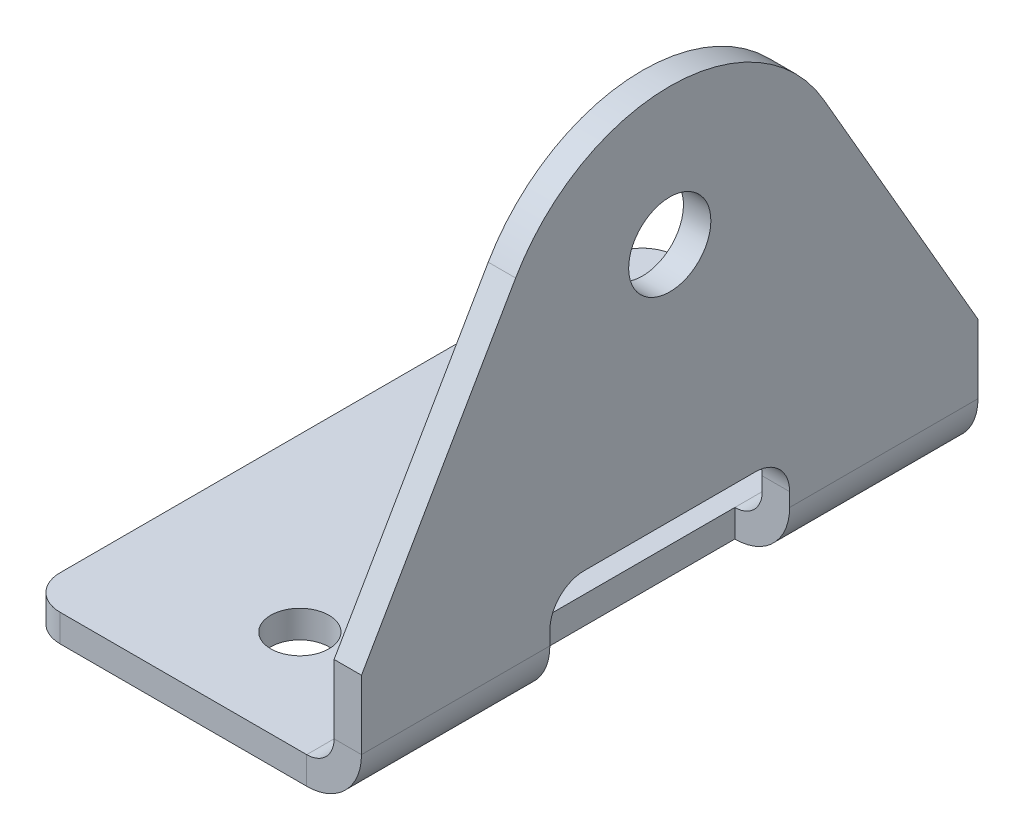
ISO-10303-21;
HEADER;
FILE_DESCRIPTION(('STEP AP214'),'2;1');
FILE_NAME('part.step','',(''),(''),'','','');
FILE_SCHEMA(('AUTOMOTIVE_DESIGN { 1 0 10303 214 1 1 1 1 }'));
ENDSEC;
DATA;
#1=APPLICATION_CONTEXT('core data for automotive mechanical design processes');
#2=APPLICATION_PROTOCOL_DEFINITION('international standard','automotive_design',2000,#1);
#3=PRODUCT_CONTEXT('',#1,'mechanical');
#4=PRODUCT('Part','Part','',(#3));
#5=PRODUCT_RELATED_PRODUCT_CATEGORY('part','',(#4));
#6=PRODUCT_DEFINITION_FORMATION('','',#4);
#7=PRODUCT_DEFINITION_CONTEXT('part definition',#1,'design');
#8=PRODUCT_DEFINITION('design','',#6,#7);
#9=PRODUCT_DEFINITION_SHAPE('','',#8);
#10=(LENGTH_UNIT() NAMED_UNIT(*) SI_UNIT(.MILLI.,.METRE.));
#11=(NAMED_UNIT(*) PLANE_ANGLE_UNIT() SI_UNIT($,.RADIAN.));
#12=(NAMED_UNIT(*) SI_UNIT($,.STERADIAN.) SOLID_ANGLE_UNIT());
#13=UNCERTAINTY_MEASURE_WITH_UNIT(LENGTH_MEASURE(1.E-05),#10,'distance_accuracy_value','');
#14=(GEOMETRIC_REPRESENTATION_CONTEXT(3) GLOBAL_UNCERTAINTY_ASSIGNED_CONTEXT((#13)) GLOBAL_UNIT_ASSIGNED_CONTEXT((#10,
#11,#12)) REPRESENTATION_CONTEXT('',''));
#15=CARTESIAN_POINT('',(0.,0.,0.));
#16=DIRECTION('',(0.,0.,1.));
#17=DIRECTION('',(1.,0.,0.));
#18=AXIS2_PLACEMENT_3D('',#15,#16,#17);
#19=CARTESIAN_POINT('',(28.5000000000002,44.0192378864669,0.));
#20=DIRECTION('',(1.,0.,0.));
#21=DIRECTION('',(0.,1.,0.));
#22=AXIS2_PLACEMENT_3D('',#19,#20,#21);
#23=CYLINDRICAL_SURFACE('',#22,25.9807621135331);
#24=DIRECTION('',(-1.,0.,0.));
#25=VECTOR('',#24,1.);
#26=CARTESIAN_POINT('',(28.5000000000002,57.0096189432335,22.4999999999999));
#27=LINE('',#26,#25);
#28=CARTESIAN_POINT('',(28.5000000000002,57.0096189432335,22.4999999999999));
#29=VERTEX_POINT('',#28);
#30=CARTESIAN_POINT('',(24.5000000000002,57.0096189432335,22.4999999999999));
#31=VERTEX_POINT('',#30);
#32=EDGE_CURVE('E292',#29,#31,#27,.T.);
#33=ORIENTED_EDGE('',*,*,#32,.F.);
#34=CARTESIAN_POINT('',(28.5000000000001,44.0192378864669,0.));
#35=DIRECTION('',(1.,0.,0.));
#36=DIRECTION('',(0.,1.,0.));
#37=AXIS2_PLACEMENT_3D('',#34,#35,#36);
#38=CIRCLE('',#37,25.9807621135331);
#39=CARTESIAN_POINT('',(28.5000000000002,57.0096189432335,-22.4999999999999));
#40=VERTEX_POINT('',#39);
#41=EDGE_CURVE('E298',#40,#29,#38,.T.);
#42=ORIENTED_EDGE('',*,*,#41,.F.);
#43=DIRECTION('',(-1.,0.,0.));
#44=VECTOR('',#43,1.);
#45=CARTESIAN_POINT('',(28.5000000000002,57.0096189432335,-22.4999999999999));
#46=LINE('',#45,#44);
#47=CARTESIAN_POINT('',(24.5000000000002,57.0096189432335,-22.4999999999999));
#48=VERTEX_POINT('',#47);
#49=EDGE_CURVE('E295',#48,#40,#46,.F.);
#50=ORIENTED_EDGE('',*,*,#49,.F.);
#51=CARTESIAN_POINT('',(24.5000000000001,44.019237886467,0.));
#52=DIRECTION('',(1.,0.,0.));
#53=DIRECTION('',(0.,1.,0.));
#54=AXIS2_PLACEMENT_3D('',#51,#52,#53);
#55=CIRCLE('',#54,25.9807621135331);
#56=EDGE_CURVE('E300',#31,#48,#55,.F.);
#57=ORIENTED_EDGE('',*,*,#56,.F.);
#58=EDGE_LOOP('',(#33,#42,#50,#57));
#59=FACE_BOUND('',#58,.T.);
#60=ADVANCED_FACE('F72',(#59),#23,.T.);
#61=CARTESIAN_POINT('',(20.5,14.9999999999999,17.5));
#62=DIRECTION('',(0.,0.,1.));
#63=DIRECTION('',(0.,-1.,0.));
#64=AXIS2_PLACEMENT_3D('',#61,#62,#63);
#65=PLANE('',#64);
#66=DIRECTION('',(0.,-1.,0.));
#67=VECTOR('',#66,1.);
#68=CARTESIAN_POINT('',(24.5,0.,17.5));
#69=LINE('',#68,#67);
#70=CARTESIAN_POINT('',(24.5,9.99999999999993,17.5));
#71=VERTEX_POINT('',#70);
#72=CARTESIAN_POINT('',(24.5,7.99999999999998,17.5));
#73=VERTEX_POINT('',#72);
#74=EDGE_CURVE('E274',#71,#73,#69,.T.);
#75=ORIENTED_EDGE('',*,*,#74,.F.);
#76=DIRECTION('',(1.,0.,0.));
#77=VECTOR('',#76,1.);
#78=CARTESIAN_POINT('',(28.5,9.99999999999991,17.5));
#79=LINE('',#78,#77);
#80=CARTESIAN_POINT('',(28.5,9.99999999999991,17.5));
#81=VERTEX_POINT('',#80);
#82=EDGE_CURVE('E327',#71,#81,#79,.T.);
#83=ORIENTED_EDGE('',*,*,#82,.T.);
#84=DIRECTION('',(0.,-1.,0.));
#85=VECTOR('',#84,1.);
#86=CARTESIAN_POINT('',(28.5,14.9999999999999,17.5));
#87=LINE('',#86,#85);
#88=CARTESIAN_POINT('',(28.5,7.99999999999997,17.5));
#89=VERTEX_POINT('',#88);
#90=EDGE_CURVE('E338',#81,#89,#87,.T.);
#91=ORIENTED_EDGE('',*,*,#90,.T.);
#92=DIRECTION('',(-1.,0.,0.));
#93=VECTOR('',#92,1.);
#94=CARTESIAN_POINT('',(28.5,7.99999999999997,17.5));
#95=LINE('',#94,#93);
#96=EDGE_CURVE('E216',#89,#73,#95,.T.);
#97=ORIENTED_EDGE('',*,*,#96,.T.);
#98=EDGE_LOOP('',(#75,#83,#91,#97));
#99=FACE_BOUND('',#98,.T.);
#100=ADVANCED_FACE('F346',(#99),#65,.F.);
#101=CARTESIAN_POINT('',(20.5,8.,-45.));
#102=DIRECTION('',(0.,0.,-1.));
#103=DIRECTION('',(1.,0.,0.));
#104=AXIS2_PLACEMENT_3D('',#101,#102,#103);
#105=CYLINDRICAL_SURFACE('',#104,8.);
#106=CARTESIAN_POINT('',(20.5,8.,17.5));
#107=DIRECTION('',(0.,0.,1.));
#108=DIRECTION('',(0.,-1.,0.));
#109=AXIS2_PLACEMENT_3D('',#106,#107,#108);
#110=CIRCLE('',#109,8.);
#111=CARTESIAN_POINT('',(20.5,0.,17.5));
#112=VERTEX_POINT('',#111);
#113=EDGE_CURVE('E209',#89,#112,#110,.F.);
#114=ORIENTED_EDGE('',*,*,#113,.F.);
#115=DIRECTION('',(0.,0.,-1.));
#116=VECTOR('',#115,1.);
#117=CARTESIAN_POINT('',(28.5,7.99999999999997,0.));
#118=LINE('',#117,#116);
#119=CARTESIAN_POINT('',(28.5,7.99999999999997,45.));
#120=VERTEX_POINT('',#119);
#121=EDGE_CURVE('E367',#120,#89,#118,.T.);
#122=ORIENTED_EDGE('',*,*,#121,.F.);
#123=CARTESIAN_POINT('',(20.5,8.,45.));
#124=DIRECTION('',(0.,0.,-1.));
#125=DIRECTION('',(-1.,0.,0.));
#126=AXIS2_PLACEMENT_3D('',#123,#124,#125);
#127=CIRCLE('',#126,8.);
#128=CARTESIAN_POINT('',(20.5,0.,45.));
#129=VERTEX_POINT('',#128);
#130=EDGE_CURVE('E249',#129,#120,#127,.F.);
#131=ORIENTED_EDGE('',*,*,#130,.F.);
#132=DIRECTION('',(0.,0.,-1.));
#133=VECTOR('',#132,1.);
#134=CARTESIAN_POINT('',(20.5,0.,45.));
#135=LINE('',#134,#133);
#136=EDGE_CURVE('E240',#129,#112,#135,.T.);
#137=ORIENTED_EDGE('',*,*,#136,.T.);
#138=EDGE_LOOP('',(#114,#122,#131,#137));
#139=FACE_BOUND('',#138,.T.);
#140=ADVANCED_FACE('F247',(#139),#105,.T.);
#141=CARTESIAN_POINT('',(20.5,8.,-45.));
#142=DIRECTION('',(0.,0.,-1.));
#143=DIRECTION('',(1.,0.,0.));
#144=AXIS2_PLACEMENT_3D('',#141,#142,#143);
#145=CYLINDRICAL_SURFACE('',#144,4.);
#146=DIRECTION('',(0.,0.,1.));
#147=VECTOR('',#146,1.);
#148=CARTESIAN_POINT('',(24.5,7.99999999999999,45.));
#149=LINE('',#148,#147);
#150=CARTESIAN_POINT('',(24.5,7.99999999999998,45.));
#151=VERTEX_POINT('',#150);
#152=EDGE_CURVE('E351',#151,#73,#149,.F.);
#153=ORIENTED_EDGE('',*,*,#152,.T.);
#154=CARTESIAN_POINT('',(20.5,8.,17.5));
#155=DIRECTION('',(0.,0.,1.));
#156=DIRECTION('',(0.,-1.,0.));
#157=AXIS2_PLACEMENT_3D('',#154,#155,#156);
#158=CIRCLE('',#157,4.);
#159=CARTESIAN_POINT('',(20.5,4.,17.5));
#160=VERTEX_POINT('',#159);
#161=EDGE_CURVE('E221',#73,#160,#158,.F.);
#162=ORIENTED_EDGE('',*,*,#161,.T.);
#163=DIRECTION('',(0.,0.,-1.));
#164=VECTOR('',#163,1.);
#165=CARTESIAN_POINT('',(20.5,4.,45.));
#166=LINE('',#165,#164);
#167=CARTESIAN_POINT('',(20.5,4.,45.));
#168=VERTEX_POINT('',#167);
#169=EDGE_CURVE('E395',#168,#160,#166,.T.);
#170=ORIENTED_EDGE('',*,*,#169,.F.);
#171=CARTESIAN_POINT('',(20.5,8.,45.));
#172=DIRECTION('',(0.,0.,-1.));
#173=DIRECTION('',(-1.,0.,0.));
#174=AXIS2_PLACEMENT_3D('',#171,#172,#173);
#175=CIRCLE('',#174,4.);
#176=EDGE_CURVE('E384',#168,#151,#175,.F.);
#177=ORIENTED_EDGE('',*,*,#176,.T.);
#178=EDGE_LOOP('',(#153,#162,#170,#177));
#179=FACE_BOUND('',#178,.T.);
#180=ADVANCED_FACE('F480',(#179),#145,.F.);
#181=CARTESIAN_POINT('',(-20.5,4.,45.));
#182=DIRECTION('',(1.,0.,0.));
#183=DIRECTION('',(0.,0.,-1.));
#184=AXIS2_PLACEMENT_3D('',#181,#182,#183);
#185=PLANE('',#184);
#186=DIRECTION('',(0.,0.,1.));
#187=VECTOR('',#186,1.);
#188=CARTESIAN_POINT('',(-20.5,4.,45.));
#189=LINE('',#188,#187);
#190=CARTESIAN_POINT('',(-20.5,4.,-40.));
#191=VERTEX_POINT('',#190);
#192=CARTESIAN_POINT('',(-20.5,4.,40.));
#193=VERTEX_POINT('',#192);
#194=EDGE_CURVE('E253',#191,#193,#189,.T.);
#195=ORIENTED_EDGE('',*,*,#194,.F.);
#196=DIRECTION('',(0.,-1.,0.));
#197=VECTOR('',#196,1.);
#198=CARTESIAN_POINT('',(-20.5,4.,-40.));
#199=LINE('',#198,#197);
#200=CARTESIAN_POINT('',(-20.5,0.,-40.));
#201=VERTEX_POINT('',#200);
#202=EDGE_CURVE('E304',#191,#201,#199,.T.);
#203=ORIENTED_EDGE('',*,*,#202,.T.);
#204=DIRECTION('',(0.,0.,1.));
#205=VECTOR('',#204,1.);
#206=CARTESIAN_POINT('',(-20.5,0.,45.));
#207=LINE('',#206,#205);
#208=CARTESIAN_POINT('',(-20.5,0.,40.));
#209=VERTEX_POINT('',#208);
#210=EDGE_CURVE('E380',#201,#209,#207,.T.);
#211=ORIENTED_EDGE('',*,*,#210,.T.);
#212=DIRECTION('',(0.,-1.,0.));
#213=VECTOR('',#212,1.);
#214=CARTESIAN_POINT('',(-20.5,4.,40.));
#215=LINE('',#214,#213);
#216=EDGE_CURVE('E302',#209,#193,#215,.F.);
#217=ORIENTED_EDGE('',*,*,#216,.T.);
#218=EDGE_LOOP('',(#195,#203,#211,#217));
#219=FACE_BOUND('',#218,.T.);
#220=ADVANCED_FACE('F412',(#219),#185,.F.);
#221=CARTESIAN_POINT('',(20.5,4.,45.));
#222=DIRECTION('',(0.,0.,-1.));
#223=DIRECTION('',(-1.,0.,0.));
#224=AXIS2_PLACEMENT_3D('',#221,#222,#223);
#225=PLANE('',#224);
#226=DIRECTION('',(1.,0.,0.));
#227=VECTOR('',#226,1.);
#228=CARTESIAN_POINT('',(20.5,4.,45.));
#229=LINE('',#228,#227);
#230=CARTESIAN_POINT('',(-15.5,4.,45.));
#231=VERTEX_POINT('',#230);
#232=EDGE_CURVE('E392',#231,#168,#229,.T.);
#233=ORIENTED_EDGE('',*,*,#232,.F.);
#234=DIRECTION('',(0.,-1.,0.));
#235=VECTOR('',#234,1.);
#236=CARTESIAN_POINT('',(-15.5,4.,45.));
#237=LINE('',#236,#235);
#238=CARTESIAN_POINT('',(-15.5,0.,45.));
#239=VERTEX_POINT('',#238);
#240=EDGE_CURVE('E317',#231,#239,#237,.T.);
#241=ORIENTED_EDGE('',*,*,#240,.T.);
#242=DIRECTION('',(1.,0.,0.));
#243=VECTOR('',#242,1.);
#244=CARTESIAN_POINT('',(20.5,0.,45.));
#245=LINE('',#244,#243);
#246=EDGE_CURVE('E255',#239,#129,#245,.T.);
#247=ORIENTED_EDGE('',*,*,#246,.T.);
#248=DIRECTION('',(0.,-1.,0.));
#249=VECTOR('',#248,1.);
#250=CARTESIAN_POINT('',(20.5,4.,45.));
#251=LINE('',#250,#249);
#252=EDGE_CURVE('E262',#168,#129,#251,.T.);
#253=ORIENTED_EDGE('',*,*,#252,.F.);
#254=EDGE_LOOP('',(#233,#241,#247,#253));
#255=FACE_BOUND('',#254,.T.);
#256=ADVANCED_FACE('F405',(#255),#225,.F.);
#257=CARTESIAN_POINT('',(20.5,4.,-45.));
#258=DIRECTION('',(0.,0.,1.));
#259=DIRECTION('',(1.,0.,0.));
#260=AXIS2_PLACEMENT_3D('',#257,#258,#259);
#261=PLANE('',#260);
#262=DIRECTION('',(-1.,0.,0.));
#263=VECTOR('',#262,1.);
#264=CARTESIAN_POINT('',(20.5,0.,-45.));
#265=LINE('',#264,#263);
#266=CARTESIAN_POINT('',(20.5,0.,-45.));
#267=VERTEX_POINT('',#266);
#268=CARTESIAN_POINT('',(-15.5,0.,-45.));
#269=VERTEX_POINT('',#268);
#270=EDGE_CURVE('E250',#267,#269,#265,.T.);
#271=ORIENTED_EDGE('',*,*,#270,.T.);
#272=DIRECTION('',(0.,-1.,0.));
#273=VECTOR('',#272,1.);
#274=CARTESIAN_POINT('',(-15.5,4.,-45.));
#275=LINE('',#274,#273);
#276=CARTESIAN_POINT('',(-15.5,4.,-45.));
#277=VERTEX_POINT('',#276);
#278=EDGE_CURVE('E311',#269,#277,#275,.F.);
#279=ORIENTED_EDGE('',*,*,#278,.T.);
#280=DIRECTION('',(-1.,0.,0.));
#281=VECTOR('',#280,1.);
#282=CARTESIAN_POINT('',(20.5,4.,-45.));
#283=LINE('',#282,#281);
#284=CARTESIAN_POINT('',(20.5,4.,-45.));
#285=VERTEX_POINT('',#284);
#286=EDGE_CURVE('E263',#285,#277,#283,.T.);
#287=ORIENTED_EDGE('',*,*,#286,.F.);
#288=DIRECTION('',(0.,-1.,0.));
#289=VECTOR('',#288,1.);
#290=CARTESIAN_POINT('',(20.5,4.,-45.));
#291=LINE('',#290,#289);
#292=EDGE_CURVE('E259',#285,#267,#291,.T.);
#293=ORIENTED_EDGE('',*,*,#292,.T.);
#294=EDGE_LOOP('',(#271,#279,#287,#293));
#295=FACE_BOUND('',#294,.T.);
#296=ADVANCED_FACE('F422',(#295),#261,.F.);
#297=CARTESIAN_POINT('',(0.,4.,0.));
#298=DIRECTION('',(0.,1.,0.));
#299=DIRECTION('',(0.,0.,1.));
#300=AXIS2_PLACEMENT_3D('',#297,#298,#299);
#301=PLANE('',#300);
#302=CARTESIAN_POINT('',(4.5,4.,30.));
#303=DIRECTION('',(0.,1.,0.));
#304=DIRECTION('',(0.,0.,1.));
#305=AXIS2_PLACEMENT_3D('',#302,#303,#304);
#306=CIRCLE('',#305,4.25);
#307=CARTESIAN_POINT('',(4.5,4.,34.25));
#308=VERTEX_POINT('',#307);
#309=EDGE_CURVE('E378',#308,#308,#306,.T.);
#310=ORIENTED_EDGE('',*,*,#309,.F.);
#311=EDGE_LOOP('',(#310));
#312=FACE_BOUND('',#311,.T.);
#313=CARTESIAN_POINT('',(4.5,4.,-30.));
#314=DIRECTION('',(0.,1.,0.));
#315=DIRECTION('',(0.,0.,1.));
#316=AXIS2_PLACEMENT_3D('',#313,#314,#315);
#317=CIRCLE('',#316,4.25);
#318=CARTESIAN_POINT('',(4.5,4.,-25.75));
#319=VERTEX_POINT('',#318);
#320=EDGE_CURVE('E448',#319,#319,#317,.T.);
#321=ORIENTED_EDGE('',*,*,#320,.F.);
#322=EDGE_LOOP('',(#321));
#323=FACE_BOUND('',#322,.T.);
#324=ORIENTED_EDGE('',*,*,#286,.T.);
#325=CARTESIAN_POINT('',(-15.5,4.,-40.));
#326=DIRECTION('',(0.,1.,0.));
#327=DIRECTION('',(0.,0.,1.));
#328=AXIS2_PLACEMENT_3D('',#325,#326,#327);
#329=CIRCLE('',#328,5.);
#330=EDGE_CURVE('E315',#277,#191,#329,.T.);
#331=ORIENTED_EDGE('',*,*,#330,.T.);
#332=ORIENTED_EDGE('',*,*,#194,.T.);
#333=CARTESIAN_POINT('',(-15.5,4.,40.));
#334=DIRECTION('',(0.,1.,0.));
#335=DIRECTION('',(0.,0.,1.));
#336=AXIS2_PLACEMENT_3D('',#333,#334,#335);
#337=CIRCLE('',#336,5.);
#338=EDGE_CURVE('E313',#193,#231,#337,.T.);
#339=ORIENTED_EDGE('',*,*,#338,.T.);
#340=ORIENTED_EDGE('',*,*,#232,.T.);
#341=ORIENTED_EDGE('',*,*,#169,.T.);
#342=CARTESIAN_POINT('',(20.5,4.,-17.5));
#343=VERTEX_POINT('',#342);
#344=EDGE_CURVE('E231',#160,#343,#166,.T.);
#345=ORIENTED_EDGE('',*,*,#344,.T.);
#346=EDGE_CURVE('E394',#343,#285,#166,.T.);
#347=ORIENTED_EDGE('',*,*,#346,.T.);
#348=EDGE_LOOP('',(#324,#331,#332,#339,#340,#341,#345,#347));
#349=FACE_BOUND('',#348,.T.);
#350=ADVANCED_FACE('F415',(#312,#323,#349),#301,.T.);
#351=CARTESIAN_POINT('',(0.,0.,0.));
#352=DIRECTION('',(0.,1.,0.));
#353=DIRECTION('',(0.,0.,1.));
#354=AXIS2_PLACEMENT_3D('',#351,#352,#353);
#355=PLANE('',#354);
#356=CARTESIAN_POINT('',(4.5,0.,30.));
#357=DIRECTION('',(0.,-1.,0.));
#358=DIRECTION('',(0.,0.,-1.));
#359=AXIS2_PLACEMENT_3D('',#356,#357,#358);
#360=CIRCLE('',#359,4.25);
#361=CARTESIAN_POINT('',(4.5,0.,25.75));
#362=VERTEX_POINT('',#361);
#363=EDGE_CURVE('E445',#362,#362,#360,.T.);
#364=ORIENTED_EDGE('',*,*,#363,.F.);
#365=EDGE_LOOP('',(#364));
#366=FACE_BOUND('',#365,.T.);
#367=CARTESIAN_POINT('',(4.5,0.,-30.));
#368=DIRECTION('',(0.,-1.,0.));
#369=DIRECTION('',(0.,0.,-1.));
#370=AXIS2_PLACEMENT_3D('',#367,#368,#369);
#371=CIRCLE('',#370,4.25);
#372=CARTESIAN_POINT('',(4.5,0.,-34.25));
#373=VERTEX_POINT('',#372);
#374=EDGE_CURVE('E269',#373,#373,#371,.T.);
#375=ORIENTED_EDGE('',*,*,#374,.F.);
#376=EDGE_LOOP('',(#375));
#377=FACE_BOUND('',#376,.T.);
#378=ORIENTED_EDGE('',*,*,#210,.F.);
#379=CARTESIAN_POINT('',(-15.5,0.,-40.));
#380=DIRECTION('',(0.,1.,0.));
#381=DIRECTION('',(0.,0.,1.));
#382=AXIS2_PLACEMENT_3D('',#379,#380,#381);
#383=CIRCLE('',#382,5.);
#384=EDGE_CURVE('E309',#201,#269,#383,.F.);
#385=ORIENTED_EDGE('',*,*,#384,.T.);
#386=ORIENTED_EDGE('',*,*,#270,.F.);
#387=CARTESIAN_POINT('',(20.5,0.,-17.5));
#388=VERTEX_POINT('',#387);
#389=EDGE_CURVE('E243',#388,#267,#135,.T.);
#390=ORIENTED_EDGE('',*,*,#389,.F.);
#391=DIRECTION('',(0.,0.,-1.));
#392=VECTOR('',#391,1.);
#393=CARTESIAN_POINT('',(20.5,0.,17.5));
#394=LINE('',#393,#392);
#395=EDGE_CURVE('E228',#112,#388,#394,.T.);
#396=ORIENTED_EDGE('',*,*,#395,.F.);
#397=ORIENTED_EDGE('',*,*,#136,.F.);
#398=ORIENTED_EDGE('',*,*,#246,.F.);
#399=CARTESIAN_POINT('',(-15.5,0.,40.));
#400=DIRECTION('',(0.,1.,0.));
#401=DIRECTION('',(0.,0.,1.));
#402=AXIS2_PLACEMENT_3D('',#399,#400,#401);
#403=CIRCLE('',#402,5.);
#404=EDGE_CURVE('E307',#239,#209,#403,.F.);
#405=ORIENTED_EDGE('',*,*,#404,.T.);
#406=EDGE_LOOP('',(#378,#385,#386,#390,#396,#397,#398,#405));
#407=FACE_BOUND('',#406,.T.);
#408=ADVANCED_FACE('F238',(#366,#377,#407),#355,.F.);
#409=CARTESIAN_POINT('',(20.5,8.,45.));
#410=DIRECTION('',(0.,0.,1.));
#411=DIRECTION('',(1.,0.,0.));
#412=AXIS2_PLACEMENT_3D('',#409,#410,#411);
#413=PLANE('',#412);
#414=DIRECTION('',(1.,0.,0.));
#415=VECTOR('',#414,1.);
#416=CARTESIAN_POINT('',(28.5,7.99999999999997,45.));
#417=LINE('',#416,#415);
#418=EDGE_CURVE('E363',#151,#120,#417,.T.);
#419=ORIENTED_EDGE('',*,*,#418,.F.);
#420=ORIENTED_EDGE('',*,*,#176,.F.);
#421=ORIENTED_EDGE('',*,*,#252,.T.);
#422=ORIENTED_EDGE('',*,*,#130,.T.);
#423=EDGE_LOOP('',(#419,#420,#421,#422));
#424=FACE_BOUND('',#423,.T.);
#425=ADVANCED_FACE('F482',(#424),#413,.T.);
#426=CARTESIAN_POINT('',(20.5,8.,-45.));
#427=DIRECTION('',(0.,0.,1.));
#428=DIRECTION('',(1.,0.,0.));
#429=AXIS2_PLACEMENT_3D('',#426,#427,#428);
#430=PLANE('',#429);
#431=CARTESIAN_POINT('',(20.5,8.,-45.));
#432=DIRECTION('',(0.,0.,-1.));
#433=DIRECTION('',(-1.,0.,0.));
#434=AXIS2_PLACEMENT_3D('',#431,#432,#433);
#435=CIRCLE('',#434,4.);
#436=CARTESIAN_POINT('',(24.5,7.99999999999998,-45.));
#437=VERTEX_POINT('',#436);
#438=EDGE_CURVE('E386',#437,#285,#435,.T.);
#439=ORIENTED_EDGE('',*,*,#438,.F.);
#440=DIRECTION('',(1.,0.,0.));
#441=VECTOR('',#440,1.);
#442=CARTESIAN_POINT('',(24.5,7.99999999999998,-45.));
#443=LINE('',#442,#441);
#444=CARTESIAN_POINT('',(28.5,7.99999999999997,-45.));
#445=VERTEX_POINT('',#444);
#446=EDGE_CURVE('E356',#437,#445,#443,.T.);
#447=ORIENTED_EDGE('',*,*,#446,.T.);
#448=CARTESIAN_POINT('',(20.5,8.,-45.));
#449=DIRECTION('',(0.,0.,-1.));
#450=DIRECTION('',(-1.,0.,0.));
#451=AXIS2_PLACEMENT_3D('',#448,#449,#450);
#452=CIRCLE('',#451,8.);
#453=EDGE_CURVE('E381',#445,#267,#452,.T.);
#454=ORIENTED_EDGE('',*,*,#453,.T.);
#455=ORIENTED_EDGE('',*,*,#292,.F.);
#456=EDGE_LOOP('',(#439,#447,#454,#455));
#457=FACE_BOUND('',#456,.T.);
#458=ADVANCED_FACE('F427',(#457),#430,.F.);
#459=CARTESIAN_POINT('',(20.5,8.,-17.5));
#460=DIRECTION('',(0.,0.,-1.));
#461=DIRECTION('',(0.,1.,0.));
#462=AXIS2_PLACEMENT_3D('',#459,#460,#461);
#463=CIRCLE('',#462,8.);
#464=CARTESIAN_POINT('',(28.5,7.99999999999997,-17.5));
#465=VERTEX_POINT('',#464);
#466=EDGE_CURVE('E433',#388,#465,#463,.F.);
#467=ORIENTED_EDGE('',*,*,#466,.F.);
#468=ORIENTED_EDGE('',*,*,#389,.T.);
#469=ORIENTED_EDGE('',*,*,#453,.F.);
#470=EDGE_CURVE('E371',#465,#445,#118,.T.);
#471=ORIENTED_EDGE('',*,*,#470,.F.);
#472=EDGE_LOOP('',(#467,#468,#469,#471));
#473=FACE_BOUND('',#472,.T.);
#474=ADVANCED_FACE('F431',(#473),#105,.T.);
#475=ORIENTED_EDGE('',*,*,#346,.F.);
#476=CARTESIAN_POINT('',(20.5,8.,-17.5));
#477=DIRECTION('',(0.,0.,-1.));
#478=DIRECTION('',(0.,1.,0.));
#479=AXIS2_PLACEMENT_3D('',#476,#477,#478);
#480=CIRCLE('',#479,4.);
#481=CARTESIAN_POINT('',(24.5,7.99999999999998,-17.5));
#482=VERTEX_POINT('',#481);
#483=EDGE_CURVE('E437',#343,#482,#480,.F.);
#484=ORIENTED_EDGE('',*,*,#483,.T.);
#485=EDGE_CURVE('E357',#482,#437,#149,.F.);
#486=ORIENTED_EDGE('',*,*,#485,.T.);
#487=ORIENTED_EDGE('',*,*,#438,.T.);
#488=EDGE_LOOP('',(#475,#484,#486,#487));
#489=FACE_BOUND('',#488,.T.);
#490=ADVANCED_FACE('F476',(#489),#145,.F.);
#491=CARTESIAN_POINT('',(28.5,3.99999999999999,-45.));
#492=DIRECTION('',(0.,0.,-1.));
#493=DIRECTION('',(0.,1.,0.));
#494=AXIS2_PLACEMENT_3D('',#491,#492,#493);
#495=PLANE('',#494);
#496=DIRECTION('',(0.,1.,0.));
#497=VECTOR('',#496,1.);
#498=CARTESIAN_POINT('',(24.5,0.,-45.));
#499=LINE('',#498,#497);
#500=CARTESIAN_POINT('',(24.5,18.0384757729338,-45.));
#501=VERTEX_POINT('',#500);
#502=EDGE_CURVE('E366',#501,#437,#499,.F.);
#503=ORIENTED_EDGE('',*,*,#502,.F.);
#504=DIRECTION('',(1.,0.,0.));
#505=VECTOR('',#504,1.);
#506=CARTESIAN_POINT('',(28.5,18.0384757729338,-45.));
#507=LINE('',#506,#505);
#508=CARTESIAN_POINT('',(28.5,18.0384757729338,-45.));
#509=VERTEX_POINT('',#508);
#510=EDGE_CURVE('E282',#501,#509,#507,.T.);
#511=ORIENTED_EDGE('',*,*,#510,.T.);
#512=DIRECTION('',(0.,-1.,0.));
#513=VECTOR('',#512,1.);
#514=CARTESIAN_POINT('',(28.5,3.99999999999999,-45.));
#515=LINE('',#514,#513);
#516=EDGE_CURVE('E389',#509,#445,#515,.T.);
#517=ORIENTED_EDGE('',*,*,#516,.T.);
#518=ORIENTED_EDGE('',*,*,#446,.F.);
#519=EDGE_LOOP('',(#503,#511,#517,#518));
#520=FACE_BOUND('',#519,.T.);
#521=ADVANCED_FACE('F469',(#520),#495,.T.);
#522=CARTESIAN_POINT('',(28.5000000000002,70.,45.));
#523=DIRECTION('',(0.,0.,1.));
#524=DIRECTION('',(0.,-1.,0.));
#525=AXIS2_PLACEMENT_3D('',#522,#523,#524);
#526=PLANE('',#525);
#527=DIRECTION('',(0.,1.,0.));
#528=VECTOR('',#527,1.);
#529=CARTESIAN_POINT('',(28.5000000000002,70.,45.));
#530=LINE('',#529,#528);
#531=CARTESIAN_POINT('',(28.5,18.0384757729337,45.));
#532=VERTEX_POINT('',#531);
#533=EDGE_CURVE('E369',#120,#532,#530,.T.);
#534=ORIENTED_EDGE('',*,*,#533,.T.);
#535=DIRECTION('',(-1.,0.,0.));
#536=VECTOR('',#535,1.);
#537=CARTESIAN_POINT('',(28.5,18.0384757729337,45.));
#538=LINE('',#537,#536);
#539=CARTESIAN_POINT('',(24.5,18.0384757729337,45.));
#540=VERTEX_POINT('',#539);
#541=EDGE_CURVE('E289',#532,#540,#538,.T.);
#542=ORIENTED_EDGE('',*,*,#541,.T.);
#543=DIRECTION('',(0.,-1.,0.));
#544=VECTOR('',#543,1.);
#545=CARTESIAN_POINT('',(24.5,0.,45.));
#546=LINE('',#545,#544);
#547=EDGE_CURVE('E353',#151,#540,#546,.F.);
#548=ORIENTED_EDGE('',*,*,#547,.F.);
#549=ORIENTED_EDGE('',*,*,#418,.T.);
#550=EDGE_LOOP('',(#534,#542,#548,#549));
#551=FACE_BOUND('',#550,.T.);
#552=ADVANCED_FACE('F362',(#551),#526,.T.);
#553=CARTESIAN_POINT('',(28.5,0.,0.));
#554=DIRECTION('',(1.,0.,0.));
#555=DIRECTION('',(0.,1.,0.));
#556=AXIS2_PLACEMENT_3D('',#553,#554,#555);
#557=PLANE('',#556);
#558=DIRECTION('',(0.,-0.866025403784438,-0.500000000000001));
#559=VECTOR('',#558,1.);
#560=CARTESIAN_POINT('',(28.5000000000001,23.9951905283833,-41.5608891324554));
#561=LINE('',#560,#559);
#562=EDGE_CURVE('E286',#509,#40,#561,.F.);
#563=ORIENTED_EDGE('',*,*,#562,.T.);
#564=ORIENTED_EDGE('',*,*,#41,.T.);
#565=DIRECTION('',(0.,0.866025403784438,-0.500000000000001));
#566=VECTOR('',#565,1.);
#567=CARTESIAN_POINT('',(28.5000000000001,23.9951905283833,41.5608891324554));
#568=LINE('',#567,#566);
#569=EDGE_CURVE('E284',#29,#532,#568,.F.);
#570=ORIENTED_EDGE('',*,*,#569,.T.);
#571=ORIENTED_EDGE('',*,*,#533,.F.);
#572=ORIENTED_EDGE('',*,*,#121,.T.);
#573=ORIENTED_EDGE('',*,*,#90,.F.);
#574=CARTESIAN_POINT('',(28.5,9.99999999999991,12.5));
#575=DIRECTION('',(1.,0.,0.));
#576=DIRECTION('',(0.,1.,0.));
#577=AXIS2_PLACEMENT_3D('',#574,#575,#576);
#578=CIRCLE('',#577,5.);
#579=CARTESIAN_POINT('',(28.5,14.9999999999999,12.5));
#580=VERTEX_POINT('',#579);
#581=EDGE_CURVE('E80',#81,#580,#578,.F.);
#582=ORIENTED_EDGE('',*,*,#581,.T.);
#583=DIRECTION('',(0.,0.,1.));
#584=VECTOR('',#583,1.);
#585=CARTESIAN_POINT('',(28.5,14.9999999999999,17.5));
#586=LINE('',#585,#584);
#587=CARTESIAN_POINT('',(28.5,14.9999999999999,-12.5));
#588=VERTEX_POINT('',#587);
#589=EDGE_CURVE('E232',#588,#580,#586,.T.);
#590=ORIENTED_EDGE('',*,*,#589,.F.);
#591=CARTESIAN_POINT('',(28.5,9.99999999999992,-12.5));
#592=DIRECTION('',(1.,0.,0.));
#593=DIRECTION('',(0.,1.,0.));
#594=AXIS2_PLACEMENT_3D('',#591,#592,#593);
#595=CIRCLE('',#594,5.);
#596=CARTESIAN_POINT('',(28.5,9.99999999999992,-17.5));
#597=VERTEX_POINT('',#596);
#598=EDGE_CURVE('E329',#588,#597,#595,.F.);
#599=ORIENTED_EDGE('',*,*,#598,.T.);
#600=DIRECTION('',(0.,1.,0.));
#601=VECTOR('',#600,1.);
#602=CARTESIAN_POINT('',(28.5,14.9999999999999,-17.5));
#603=LINE('',#602,#601);
#604=EDGE_CURVE('E343',#465,#597,#603,.T.);
#605=ORIENTED_EDGE('',*,*,#604,.F.);
#606=ORIENTED_EDGE('',*,*,#470,.T.);
#607=ORIENTED_EDGE('',*,*,#516,.F.);
#608=EDGE_LOOP('',(#563,#564,#570,#571,#572,#573,#582,#590,#599,#605,#606,#607));
#609=FACE_BOUND('',#608,.T.);
#610=CARTESIAN_POINT('',(28.5000000000001,50.,0.));
#611=DIRECTION('',(1.,0.,0.));
#612=DIRECTION('',(0.,1.,0.));
#613=AXIS2_PLACEMENT_3D('',#610,#611,#612);
#614=CIRCLE('',#613,6.);
#615=CARTESIAN_POINT('',(28.5000000000002,56.,0.));
#616=VERTEX_POINT('',#615);
#617=EDGE_CURVE('E220',#616,#616,#614,.T.);
#618=ORIENTED_EDGE('',*,*,#617,.F.);
#619=EDGE_LOOP('',(#618));
#620=FACE_BOUND('',#619,.T.);
#621=ADVANCED_FACE('F336',(#609,#620),#557,.T.);
#622=CARTESIAN_POINT('',(24.5,0.,0.));
#623=DIRECTION('',(1.,0.,0.));
#624=DIRECTION('',(0.,1.,0.));
#625=AXIS2_PLACEMENT_3D('',#622,#623,#624);
#626=PLANE('',#625);
#627=CARTESIAN_POINT('',(24.5000000000001,50.,0.));
#628=DIRECTION('',(1.,0.,0.));
#629=DIRECTION('',(0.,1.,0.));
#630=AXIS2_PLACEMENT_3D('',#627,#628,#629);
#631=CIRCLE('',#630,6.);
#632=CARTESIAN_POINT('',(24.5000000000002,56.,0.));
#633=VERTEX_POINT('',#632);
#634=EDGE_CURVE('E266',#633,#633,#631,.T.);
#635=ORIENTED_EDGE('',*,*,#634,.T.);
#636=EDGE_LOOP('',(#635));
#637=FACE_BOUND('',#636,.T.);
#638=DIRECTION('',(0.,-0.866025403784438,0.500000000000001));
#639=VECTOR('',#638,1.);
#640=CARTESIAN_POINT('',(24.5,18.0384757729337,45.));
#641=LINE('',#640,#639);
#642=EDGE_CURVE('E277',#540,#31,#641,.F.);
#643=ORIENTED_EDGE('',*,*,#642,.T.);
#644=ORIENTED_EDGE('',*,*,#56,.T.);
#645=DIRECTION('',(0.,0.866025403784438,0.500000000000001));
#646=VECTOR('',#645,1.);
#647=CARTESIAN_POINT('',(24.5000000000002,70.,-14.9999999999999));
#648=LINE('',#647,#646);
#649=EDGE_CURVE('E280',#48,#501,#648,.F.);
#650=ORIENTED_EDGE('',*,*,#649,.T.);
#651=ORIENTED_EDGE('',*,*,#502,.T.);
#652=ORIENTED_EDGE('',*,*,#485,.F.);
#653=DIRECTION('',(0.,1.,0.));
#654=VECTOR('',#653,1.);
#655=CARTESIAN_POINT('',(24.5,0.,-17.5));
#656=LINE('',#655,#654);
#657=CARTESIAN_POINT('',(24.5,9.99999999999993,-17.5));
#658=VERTEX_POINT('',#657);
#659=EDGE_CURVE('E265',#482,#658,#656,.T.);
#660=ORIENTED_EDGE('',*,*,#659,.T.);
#661=CARTESIAN_POINT('',(24.5,9.99999999999993,-12.5));
#662=DIRECTION('',(1.,0.,0.));
#663=DIRECTION('',(0.,1.,0.));
#664=AXIS2_PLACEMENT_3D('',#661,#662,#663);
#665=CIRCLE('',#664,5.);
#666=CARTESIAN_POINT('',(24.5,14.9999999999999,-12.5));
#667=VERTEX_POINT('',#666);
#668=EDGE_CURVE('E331',#658,#667,#665,.T.);
#669=ORIENTED_EDGE('',*,*,#668,.T.);
#670=DIRECTION('',(0.,0.,1.));
#671=VECTOR('',#670,1.);
#672=CARTESIAN_POINT('',(24.5,14.9999999999999,0.));
#673=LINE('',#672,#671);
#674=CARTESIAN_POINT('',(24.5,14.9999999999999,12.5));
#675=VERTEX_POINT('',#674);
#676=EDGE_CURVE('E272',#667,#675,#673,.T.);
#677=ORIENTED_EDGE('',*,*,#676,.T.);
#678=CARTESIAN_POINT('',(24.5,9.99999999999993,12.5));
#679=DIRECTION('',(1.,0.,0.));
#680=DIRECTION('',(0.,1.,0.));
#681=AXIS2_PLACEMENT_3D('',#678,#679,#680);
#682=CIRCLE('',#681,5.);
#683=EDGE_CURVE('E13',#675,#71,#682,.T.);
#684=ORIENTED_EDGE('',*,*,#683,.T.);
#685=ORIENTED_EDGE('',*,*,#74,.T.);
#686=ORIENTED_EDGE('',*,*,#152,.F.);
#687=ORIENTED_EDGE('',*,*,#547,.T.);
#688=EDGE_LOOP('',(#643,#644,#650,#651,#652,#660,#669,#677,#684,#685,#686,#687));
#689=FACE_BOUND('',#688,.T.);
#690=ADVANCED_FACE('F348',(#637,#689),#626,.F.);
#691=CARTESIAN_POINT('',(4.5,10.,-30.));
#692=DIRECTION('',(0.,-1.,0.));
#693=DIRECTION('',(0.,0.,-1.));
#694=AXIS2_PLACEMENT_3D('',#691,#692,#693);
#695=CYLINDRICAL_SURFACE('',#694,4.25);
#696=ORIENTED_EDGE('',*,*,#320,.T.);
#697=EDGE_LOOP('',(#696));
#698=FACE_BOUND('',#697,.T.);
#699=ORIENTED_EDGE('',*,*,#374,.T.);
#700=EDGE_LOOP('',(#699));
#701=FACE_BOUND('',#700,.T.);
#702=ADVANCED_FACE('F535',(#698,#701),#695,.F.);
#703=CARTESIAN_POINT('',(4.5,10.,30.));
#704=DIRECTION('',(0.,-1.,0.));
#705=DIRECTION('',(0.,0.,-1.));
#706=AXIS2_PLACEMENT_3D('',#703,#704,#705);
#707=CYLINDRICAL_SURFACE('',#706,4.25);
#708=ORIENTED_EDGE('',*,*,#309,.T.);
#709=EDGE_LOOP('',(#708));
#710=FACE_BOUND('',#709,.T.);
#711=ORIENTED_EDGE('',*,*,#363,.T.);
#712=EDGE_LOOP('',(#711));
#713=FACE_BOUND('',#712,.T.);
#714=ADVANCED_FACE('F531',(#710,#713),#707,.F.);
#715=CARTESIAN_POINT('',(18.5000000000001,50.0000000000001,0.));
#716=DIRECTION('',(1.,0.,0.));
#717=DIRECTION('',(0.,1.,0.));
#718=AXIS2_PLACEMENT_3D('',#715,#716,#717);
#719=CYLINDRICAL_SURFACE('',#718,6.);
#720=ORIENTED_EDGE('',*,*,#617,.T.);
#721=EDGE_LOOP('',(#720));
#722=FACE_BOUND('',#721,.T.);
#723=ORIENTED_EDGE('',*,*,#634,.F.);
#724=EDGE_LOOP('',(#723));
#725=FACE_BOUND('',#724,.T.);
#726=ADVANCED_FACE('F528',(#722,#725),#719,.F.);
#727=CARTESIAN_POINT('',(20.5,0.,0.));
#728=DIRECTION('',(1.,0.,0.));
#729=DIRECTION('',(0.,1.,0.));
#730=AXIS2_PLACEMENT_3D('',#727,#728,#729);
#731=PLANE('',#730);
#732=ORIENTED_EDGE('',*,*,#344,.F.);
#733=DIRECTION('',(0.,-1.,0.));
#734=VECTOR('',#733,1.);
#735=CARTESIAN_POINT('',(20.5,14.9999999999999,17.5));
#736=LINE('',#735,#734);
#737=EDGE_CURVE('E213',#160,#112,#736,.T.);
#738=ORIENTED_EDGE('',*,*,#737,.T.);
#739=ORIENTED_EDGE('',*,*,#395,.T.);
#740=DIRECTION('',(0.,1.,0.));
#741=VECTOR('',#740,1.);
#742=CARTESIAN_POINT('',(20.5,14.9999999999999,-17.5));
#743=LINE('',#742,#741);
#744=EDGE_CURVE('E244',#388,#343,#743,.T.);
#745=ORIENTED_EDGE('',*,*,#744,.T.);
#746=EDGE_LOOP('',(#732,#738,#739,#745));
#747=FACE_BOUND('',#746,.T.);
#748=ADVANCED_FACE('F226',(#747),#731,.T.);
#749=ORIENTED_EDGE('',*,*,#96,.F.);
#750=ORIENTED_EDGE('',*,*,#113,.T.);
#751=ORIENTED_EDGE('',*,*,#737,.F.);
#752=ORIENTED_EDGE('',*,*,#161,.F.);
#753=EDGE_LOOP('',(#749,#750,#751,#752));
#754=FACE_BOUND('',#753,.T.);
#755=ADVANCED_FACE('F211',(#754),#65,.F.);
#756=CARTESIAN_POINT('',(20.5,14.9999999999999,17.5));
#757=DIRECTION('',(0.,1.,0.));
#758=DIRECTION('',(-1.,0.,0.));
#759=AXIS2_PLACEMENT_3D('',#756,#757,#758);
#760=PLANE('',#759);
#761=ORIENTED_EDGE('',*,*,#676,.F.);
#762=DIRECTION('',(1.,0.,0.));
#763=VECTOR('',#762,1.);
#764=CARTESIAN_POINT('',(28.5,14.9999999999999,-12.5));
#765=LINE('',#764,#763);
#766=EDGE_CURVE('E322',#667,#588,#765,.T.);
#767=ORIENTED_EDGE('',*,*,#766,.T.);
#768=ORIENTED_EDGE('',*,*,#589,.T.);
#769=DIRECTION('',(1.,0.,0.));
#770=VECTOR('',#769,1.);
#771=CARTESIAN_POINT('',(24.5,14.9999999999999,12.5));
#772=LINE('',#771,#770);
#773=EDGE_CURVE('E320',#580,#675,#772,.F.);
#774=ORIENTED_EDGE('',*,*,#773,.T.);
#775=EDGE_LOOP('',(#761,#767,#768,#774));
#776=FACE_BOUND('',#775,.T.);
#777=ADVANCED_FACE('F341',(#776),#760,.F.);
#778=CARTESIAN_POINT('',(20.5,14.9999999999999,-17.5));
#779=DIRECTION('',(0.,0.,-1.));
#780=DIRECTION('',(0.,1.,0.));
#781=AXIS2_PLACEMENT_3D('',#778,#779,#780);
#782=PLANE('',#781);
#783=ORIENTED_EDGE('',*,*,#604,.T.);
#784=DIRECTION('',(1.,0.,0.));
#785=VECTOR('',#784,1.);
#786=CARTESIAN_POINT('',(24.5,9.99999999999993,-17.5));
#787=LINE('',#786,#785);
#788=EDGE_CURVE('E325',#597,#658,#787,.F.);
#789=ORIENTED_EDGE('',*,*,#788,.T.);
#790=ORIENTED_EDGE('',*,*,#659,.F.);
#791=ORIENTED_EDGE('',*,*,#483,.F.);
#792=ORIENTED_EDGE('',*,*,#744,.F.);
#793=ORIENTED_EDGE('',*,*,#466,.T.);
#794=EDGE_LOOP('',(#783,#789,#790,#791,#792,#793));
#795=FACE_BOUND('',#794,.T.);
#796=ADVANCED_FACE('F518',(#795),#782,.F.);
#797=CARTESIAN_POINT('',(28.5000000000002,70.,-14.9999999999999));
#798=DIRECTION('',(0.,-0.500000000000001,0.866025403784438));
#799=DIRECTION('',(-1.,0.,0.));
#800=AXIS2_PLACEMENT_3D('',#797,#798,#799);
#801=PLANE('',#800);
#802=ORIENTED_EDGE('',*,*,#649,.F.);
#803=ORIENTED_EDGE('',*,*,#49,.T.);
#804=ORIENTED_EDGE('',*,*,#562,.F.);
#805=ORIENTED_EDGE('',*,*,#510,.F.);
#806=EDGE_LOOP('',(#802,#803,#804,#805));
#807=FACE_BOUND('',#806,.T.);
#808=ADVANCED_FACE('F466',(#807),#801,.F.);
#809=CARTESIAN_POINT('',(28.5,18.0384757729337,45.));
#810=DIRECTION('',(0.,-0.500000000000001,-0.866025403784438));
#811=DIRECTION('',(-1.,0.,0.));
#812=AXIS2_PLACEMENT_3D('',#809,#810,#811);
#813=PLANE('',#812);
#814=ORIENTED_EDGE('',*,*,#569,.F.);
#815=ORIENTED_EDGE('',*,*,#32,.T.);
#816=ORIENTED_EDGE('',*,*,#642,.F.);
#817=ORIENTED_EDGE('',*,*,#541,.F.);
#818=EDGE_LOOP('',(#814,#815,#816,#817));
#819=FACE_BOUND('',#818,.T.);
#820=ADVANCED_FACE('F457',(#819),#813,.F.);
#821=CARTESIAN_POINT('',(-15.5,4.,-40.));
#822=DIRECTION('',(0.,-1.,0.));
#823=DIRECTION('',(0.,0.,-1.));
#824=AXIS2_PLACEMENT_3D('',#821,#822,#823);
#825=CYLINDRICAL_SURFACE('',#824,5.);
#826=ORIENTED_EDGE('',*,*,#330,.F.);
#827=ORIENTED_EDGE('',*,*,#278,.F.);
#828=ORIENTED_EDGE('',*,*,#384,.F.);
#829=ORIENTED_EDGE('',*,*,#202,.F.);
#830=EDGE_LOOP('',(#826,#827,#828,#829));
#831=FACE_BOUND('',#830,.T.);
#832=ADVANCED_FACE('F420',(#831),#825,.T.);
#833=CARTESIAN_POINT('',(-15.5,4.,40.));
#834=DIRECTION('',(0.,-1.,0.));
#835=DIRECTION('',(0.,0.,-1.));
#836=AXIS2_PLACEMENT_3D('',#833,#834,#835);
#837=CYLINDRICAL_SURFACE('',#836,5.);
#838=ORIENTED_EDGE('',*,*,#338,.F.);
#839=ORIENTED_EDGE('',*,*,#216,.F.);
#840=ORIENTED_EDGE('',*,*,#404,.F.);
#841=ORIENTED_EDGE('',*,*,#240,.F.);
#842=EDGE_LOOP('',(#838,#839,#840,#841));
#843=FACE_BOUND('',#842,.T.);
#844=ADVANCED_FACE('F410',(#843),#837,.T.);
#845=CARTESIAN_POINT('',(20.5,9.99999999999995,-12.5));
#846=DIRECTION('',(-1.,0.,0.));
#847=DIRECTION('',(0.,-1.,0.));
#848=AXIS2_PLACEMENT_3D('',#845,#846,#847);
#849=CYLINDRICAL_SURFACE('',#848,5.);
#850=ORIENTED_EDGE('',*,*,#668,.F.);
#851=ORIENTED_EDGE('',*,*,#788,.F.);
#852=ORIENTED_EDGE('',*,*,#598,.F.);
#853=ORIENTED_EDGE('',*,*,#766,.F.);
#854=EDGE_LOOP('',(#850,#851,#852,#853));
#855=FACE_BOUND('',#854,.T.);
#856=ADVANCED_FACE('F511',(#855),#849,.F.);
#857=CARTESIAN_POINT('',(20.5,9.99999999999994,12.5));
#858=DIRECTION('',(-1.,0.,0.));
#859=DIRECTION('',(0.,-1.,0.));
#860=AXIS2_PLACEMENT_3D('',#857,#858,#859);
#861=CYLINDRICAL_SURFACE('',#860,5.);
#862=ORIENTED_EDGE('',*,*,#683,.F.);
#863=ORIENTED_EDGE('',*,*,#773,.F.);
#864=ORIENTED_EDGE('',*,*,#581,.F.);
#865=ORIENTED_EDGE('',*,*,#82,.F.);
#866=EDGE_LOOP('',(#862,#863,#864,#865));
#867=FACE_BOUND('',#866,.T.);
#868=ADVANCED_FACE('F74',(#867),#861,.F.);
#869=CLOSED_SHELL('',(#60,#100,#140,#180,#220,#256,#296,#350,#408,#425,#458,#474,#490,#521,#552,
#621,#690,#702,#714,#726,#748,#755,#777,#796,#808,#820,#832,#844,#856,#868));
#870=MANIFOLD_SOLID_BREP('B2',#869);
#871=ADVANCED_BREP_SHAPE_REPRESENTATION('',(#18,#870),#14);
#872=SHAPE_DEFINITION_REPRESENTATION(#9,#871);
ENDSEC;
END-ISO-10303-21;
